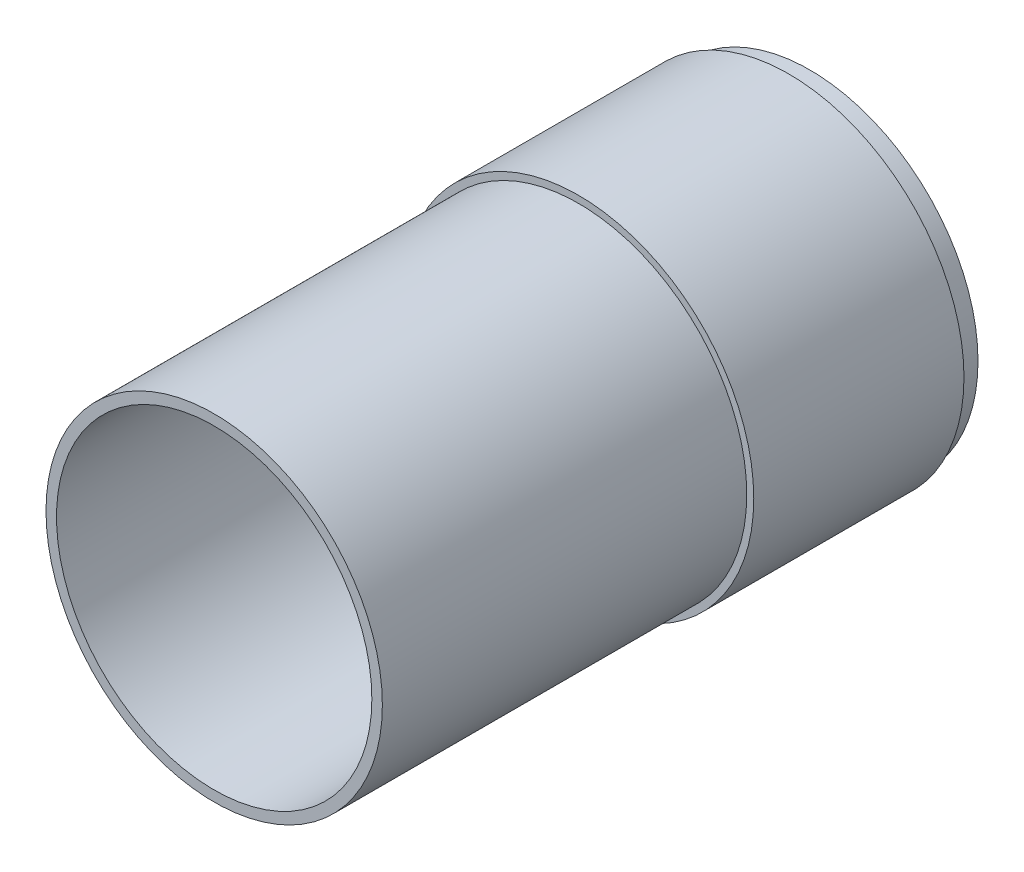
ISO-10303-21;
HEADER;
FILE_DESCRIPTION(('STEP AP214'),'2;1');
FILE_NAME('part.step','',(''),(''),'','','');
FILE_SCHEMA(('AUTOMOTIVE_DESIGN { 1 0 10303 214 1 1 1 1 }'));
ENDSEC;
DATA;
#1=APPLICATION_CONTEXT('core data for automotive mechanical design processes');
#2=APPLICATION_PROTOCOL_DEFINITION('international standard','automotive_design',2000,#1);
#3=PRODUCT_CONTEXT('',#1,'mechanical');
#4=PRODUCT('Part','Part','',(#3));
#5=PRODUCT_RELATED_PRODUCT_CATEGORY('part','',(#4));
#6=PRODUCT_DEFINITION_FORMATION('','',#4);
#7=PRODUCT_DEFINITION_CONTEXT('part definition',#1,'design');
#8=PRODUCT_DEFINITION('design','',#6,#7);
#9=PRODUCT_DEFINITION_SHAPE('','',#8);
#10=(LENGTH_UNIT() NAMED_UNIT(*) SI_UNIT(.MILLI.,.METRE.));
#11=(NAMED_UNIT(*) PLANE_ANGLE_UNIT() SI_UNIT($,.RADIAN.));
#12=(NAMED_UNIT(*) SI_UNIT($,.STERADIAN.) SOLID_ANGLE_UNIT());
#13=UNCERTAINTY_MEASURE_WITH_UNIT(LENGTH_MEASURE(1.E-05),#10,'distance_accuracy_value','');
#14=(GEOMETRIC_REPRESENTATION_CONTEXT(3) GLOBAL_UNCERTAINTY_ASSIGNED_CONTEXT((#13)) GLOBAL_UNIT_ASSIGNED_CONTEXT((#10,
#11,#12)) REPRESENTATION_CONTEXT('',''));
#15=CARTESIAN_POINT('',(0.,0.,0.));
#16=DIRECTION('',(0.,0.,1.));
#17=DIRECTION('',(1.,0.,0.));
#18=AXIS2_PLACEMENT_3D('',#15,#16,#17);
#19=CARTESIAN_POINT('',(0.,0.,0.));
#20=DIRECTION('',(0.,0.,1.));
#21=DIRECTION('',(1.,0.,0.));
#22=AXIS2_PLACEMENT_3D('',#19,#20,#21);
#23=CYLINDRICAL_SURFACE('',#22,25.);
#24=CARTESIAN_POINT('',(0.,0.,3.));
#25=DIRECTION('',(0.,0.,1.));
#26=DIRECTION('',(1.,0.,0.));
#27=AXIS2_PLACEMENT_3D('',#24,#25,#26);
#28=CIRCLE('',#27,25.);
#29=CARTESIAN_POINT('',(25.,0.,3.));
#30=VERTEX_POINT('',#29);
#31=EDGE_CURVE('E48',#30,#30,#28,.T.);
#32=ORIENTED_EDGE('',*,*,#31,.T.);
#33=EDGE_LOOP('',(#32));
#34=FACE_BOUND('',#33,.T.);
#35=CARTESIAN_POINT('',(0.,0.,33.));
#36=DIRECTION('',(0.,0.,1.));
#37=DIRECTION('',(1.,0.,0.));
#38=AXIS2_PLACEMENT_3D('',#35,#36,#37);
#39=CIRCLE('',#38,25.);
#40=CARTESIAN_POINT('',(25.,0.,33.));
#41=VERTEX_POINT('',#40);
#42=EDGE_CURVE('E18',#41,#41,#39,.F.);
#43=ORIENTED_EDGE('',*,*,#42,.T.);
#44=EDGE_LOOP('',(#43));
#45=FACE_BOUND('',#44,.T.);
#46=ADVANCED_FACE('F15',(#34,#45),#23,.T.);
#47=CARTESIAN_POINT('',(0.,0.,33.));
#48=DIRECTION('',(0.,0.,-1.));
#49=DIRECTION('',(-1.,0.,0.));
#50=AXIS2_PLACEMENT_3D('',#47,#48,#49);
#51=PLANE('',#50);
#52=CARTESIAN_POINT('',(0.,0.,33.));
#53=DIRECTION('',(0.,0.,-1.));
#54=DIRECTION('',(-1.,0.,0.));
#55=AXIS2_PLACEMENT_3D('',#52,#53,#54);
#56=CIRCLE('',#55,24.);
#57=CARTESIAN_POINT('',(-24.,0.,33.));
#58=VERTEX_POINT('',#57);
#59=EDGE_CURVE('E45',#58,#58,#56,.F.);
#60=ORIENTED_EDGE('',*,*,#59,.F.);
#61=EDGE_LOOP('',(#60));
#62=FACE_BOUND('',#61,.T.);
#63=ORIENTED_EDGE('',*,*,#42,.F.);
#64=EDGE_LOOP('',(#63));
#65=FACE_BOUND('',#64,.T.);
#66=ADVANCED_FACE('F57',(#62,#65),#51,.F.);
#67=CARTESIAN_POINT('',(0.,0.,3.));
#68=DIRECTION('',(0.,0.,1.));
#69=DIRECTION('',(1.,0.,0.));
#70=AXIS2_PLACEMENT_3D('',#67,#68,#69);
#71=PLANE('',#70);
#72=CARTESIAN_POINT('',(0.,0.,3.));
#73=DIRECTION('',(0.,0.,1.));
#74=DIRECTION('',(1.,0.,0.));
#75=AXIS2_PLACEMENT_3D('',#72,#73,#74);
#76=CIRCLE('',#75,24.);
#77=CARTESIAN_POINT('',(24.,0.,3.));
#78=VERTEX_POINT('',#77);
#79=EDGE_CURVE('E41',#78,#78,#76,.F.);
#80=ORIENTED_EDGE('',*,*,#79,.F.);
#81=EDGE_LOOP('',(#80));
#82=FACE_BOUND('',#81,.T.);
#83=ORIENTED_EDGE('',*,*,#31,.F.);
#84=EDGE_LOOP('',(#83));
#85=FACE_BOUND('',#84,.T.);
#86=ADVANCED_FACE('F59',(#82,#85),#71,.F.);
#87=CARTESIAN_POINT('',(0.,0.,85.));
#88=DIRECTION('',(0.,0.,-1.));
#89=DIRECTION('',(-1.,0.,0.));
#90=AXIS2_PLACEMENT_3D('',#87,#88,#89);
#91=CYLINDRICAL_SURFACE('',#90,24.);
#92=CARTESIAN_POINT('',(0.,0.,85.));
#93=DIRECTION('',(0.,0.,-1.));
#94=DIRECTION('',(-1.,0.,0.));
#95=AXIS2_PLACEMENT_3D('',#92,#93,#94);
#96=CIRCLE('',#95,24.);
#97=CARTESIAN_POINT('',(-24.,0.,85.));
#98=VERTEX_POINT('',#97);
#99=EDGE_CURVE('E37',#98,#98,#96,.T.);
#100=ORIENTED_EDGE('',*,*,#99,.T.);
#101=EDGE_LOOP('',(#100));
#102=FACE_BOUND('',#101,.T.);
#103=ORIENTED_EDGE('',*,*,#59,.T.);
#104=EDGE_LOOP('',(#103));
#105=FACE_BOUND('',#104,.T.);
#106=ADVANCED_FACE('F65',(#102,#105),#91,.T.);
#107=CARTESIAN_POINT('',(0.,0.,0.));
#108=DIRECTION('',(0.,0.,1.));
#109=DIRECTION('',(1.,0.,0.));
#110=AXIS2_PLACEMENT_3D('',#107,#108,#109);
#111=CYLINDRICAL_SURFACE('',#110,24.);
#112=CARTESIAN_POINT('',(0.,0.,0.));
#113=DIRECTION('',(0.,0.,1.));
#114=DIRECTION('',(1.,0.,0.));
#115=AXIS2_PLACEMENT_3D('',#112,#113,#114);
#116=CIRCLE('',#115,24.);
#117=CARTESIAN_POINT('',(24.,0.,0.));
#118=VERTEX_POINT('',#117);
#119=EDGE_CURVE('E32',#118,#118,#116,.F.);
#120=ORIENTED_EDGE('',*,*,#119,.F.);
#121=EDGE_LOOP('',(#120));
#122=FACE_BOUND('',#121,.T.);
#123=ORIENTED_EDGE('',*,*,#79,.T.);
#124=EDGE_LOOP('',(#123));
#125=FACE_BOUND('',#124,.T.);
#126=ADVANCED_FACE('F83',(#122,#125),#111,.T.);
#127=CARTESIAN_POINT('',(0.,0.,85.));
#128=DIRECTION('',(0.,0.,-1.));
#129=DIRECTION('',(-1.,0.,0.));
#130=AXIS2_PLACEMENT_3D('',#127,#128,#129);
#131=PLANE('',#130);
#132=CARTESIAN_POINT('',(0.,0.,85.));
#133=DIRECTION('',(0.,0.,1.));
#134=DIRECTION('',(1.,0.,0.));
#135=AXIS2_PLACEMENT_3D('',#132,#133,#134);
#136=CIRCLE('',#135,22.5);
#137=CARTESIAN_POINT('',(22.5,0.,85.));
#138=VERTEX_POINT('',#137);
#139=EDGE_CURVE('E23',#138,#138,#136,.F.);
#140=ORIENTED_EDGE('',*,*,#139,.T.);
#141=EDGE_LOOP('',(#140));
#142=FACE_BOUND('',#141,.T.);
#143=ORIENTED_EDGE('',*,*,#99,.F.);
#144=EDGE_LOOP('',(#143));
#145=FACE_BOUND('',#144,.T.);
#146=ADVANCED_FACE('F77',(#142,#145),#131,.F.);
#147=CARTESIAN_POINT('',(0.,0.,0.));
#148=DIRECTION('',(0.,0.,-1.));
#149=DIRECTION('',(-1.,0.,0.));
#150=AXIS2_PLACEMENT_3D('',#147,#148,#149);
#151=PLANE('',#150);
#152=CARTESIAN_POINT('',(0.,0.,0.));
#153=DIRECTION('',(0.,0.,1.));
#154=DIRECTION('',(1.,0.,0.));
#155=AXIS2_PLACEMENT_3D('',#152,#153,#154);
#156=CIRCLE('',#155,22.5);
#157=CARTESIAN_POINT('',(22.5,0.,0.));
#158=VERTEX_POINT('',#157);
#159=EDGE_CURVE('E10',#158,#158,#156,.T.);
#160=ORIENTED_EDGE('',*,*,#159,.T.);
#161=EDGE_LOOP('',(#160));
#162=FACE_BOUND('',#161,.T.);
#163=ORIENTED_EDGE('',*,*,#119,.T.);
#164=EDGE_LOOP('',(#163));
#165=FACE_BOUND('',#164,.T.);
#166=ADVANCED_FACE('F71',(#162,#165),#151,.T.);
#167=CARTESIAN_POINT('',(0.,0.,0.));
#168=DIRECTION('',(0.,0.,1.));
#169=DIRECTION('',(1.,0.,0.));
#170=AXIS2_PLACEMENT_3D('',#167,#168,#169);
#171=CYLINDRICAL_SURFACE('',#170,22.5);
#172=ORIENTED_EDGE('',*,*,#159,.F.);
#173=EDGE_LOOP('',(#172));
#174=FACE_BOUND('',#173,.T.);
#175=ORIENTED_EDGE('',*,*,#139,.F.);
#176=EDGE_LOOP('',(#175));
#177=FACE_BOUND('',#176,.T.);
#178=ADVANCED_FACE('F69',(#174,#177),#171,.F.);
#179=CLOSED_SHELL('',(#46,#66,#86,#106,#126,#146,#166,#178));
#180=MANIFOLD_SOLID_BREP('B1',#179);
#181=ADVANCED_BREP_SHAPE_REPRESENTATION('',(#18,#180),#14);
#182=SHAPE_DEFINITION_REPRESENTATION(#9,#181);
ENDSEC;
END-ISO-10303-21;
